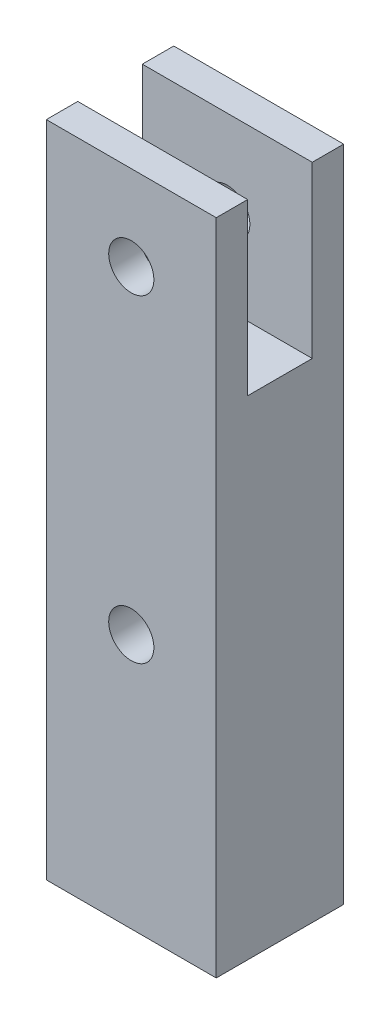
ISO-10303-21;
HEADER;
FILE_DESCRIPTION(('STEP AP214'),'2;1');
FILE_NAME('part.step','',(''),(''),'','','');
FILE_SCHEMA(('AUTOMOTIVE_DESIGN { 1 0 10303 214 1 1 1 1 }'));
ENDSEC;
DATA;
#1=APPLICATION_CONTEXT('core data for automotive mechanical design processes');
#2=APPLICATION_PROTOCOL_DEFINITION('international standard','automotive_design',2000,#1);
#3=PRODUCT_CONTEXT('',#1,'mechanical');
#4=PRODUCT('Part','Part','',(#3));
#5=PRODUCT_RELATED_PRODUCT_CATEGORY('part','',(#4));
#6=PRODUCT_DEFINITION_FORMATION('','',#4);
#7=PRODUCT_DEFINITION_CONTEXT('part definition',#1,'design');
#8=PRODUCT_DEFINITION('design','',#6,#7);
#9=PRODUCT_DEFINITION_SHAPE('','',#8);
#10=(LENGTH_UNIT() NAMED_UNIT(*) SI_UNIT(.MILLI.,.METRE.));
#11=(NAMED_UNIT(*) PLANE_ANGLE_UNIT() SI_UNIT($,.RADIAN.));
#12=(NAMED_UNIT(*) SI_UNIT($,.STERADIAN.) SOLID_ANGLE_UNIT());
#13=UNCERTAINTY_MEASURE_WITH_UNIT(LENGTH_MEASURE(1.E-05),#10,'distance_accuracy_value','');
#14=(GEOMETRIC_REPRESENTATION_CONTEXT(3) GLOBAL_UNCERTAINTY_ASSIGNED_CONTEXT((#13)) GLOBAL_UNIT_ASSIGNED_CONTEXT((#10,
#11,#12)) REPRESENTATION_CONTEXT('',''));
#15=CARTESIAN_POINT('',(0.,0.,0.));
#16=DIRECTION('',(0.,0.,1.));
#17=DIRECTION('',(1.,0.,0.));
#18=AXIS2_PLACEMENT_3D('',#15,#16,#17);
#19=CARTESIAN_POINT('',(-12.7,36.5125,9.525));
#20=DIRECTION('',(0.,-1.,0.));
#21=DIRECTION('',(1.,0.,0.));
#22=AXIS2_PLACEMENT_3D('',#19,#20,#21);
#23=PLANE('',#22);
#24=DIRECTION('',(0.,0.,-1.));
#25=VECTOR('',#24,1.);
#26=CARTESIAN_POINT('',(12.7,36.5125,9.525));
#27=LINE('',#26,#25);
#28=CARTESIAN_POINT('',(12.7,36.5125,9.525));
#29=VERTEX_POINT('',#28);
#30=CARTESIAN_POINT('',(12.7,36.5125,4.826));
#31=VERTEX_POINT('',#30);
#32=EDGE_CURVE('E11',#29,#31,#27,.T.);
#33=ORIENTED_EDGE('',*,*,#32,.T.);
#34=DIRECTION('',(1.,0.,0.));
#35=VECTOR('',#34,1.);
#36=CARTESIAN_POINT('',(-12.7,36.5125,4.826));
#37=LINE('',#36,#35);
#38=CARTESIAN_POINT('',(-12.7,36.5125,4.826));
#39=VERTEX_POINT('',#38);
#40=EDGE_CURVE('E146',#39,#31,#37,.T.);
#41=ORIENTED_EDGE('',*,*,#40,.F.);
#42=DIRECTION('',(0.,0.,-1.));
#43=VECTOR('',#42,1.);
#44=CARTESIAN_POINT('',(-12.7,36.5125,9.525));
#45=LINE('',#44,#43);
#46=CARTESIAN_POINT('',(-12.7,36.5125,9.525));
#47=VERTEX_POINT('',#46);
#48=EDGE_CURVE('E137',#47,#39,#45,.T.);
#49=ORIENTED_EDGE('',*,*,#48,.F.);
#50=DIRECTION('',(-1.,0.,0.));
#51=VECTOR('',#50,1.);
#52=CARTESIAN_POINT('',(-12.7,36.5125,9.525));
#53=LINE('',#52,#51);
#54=EDGE_CURVE('E96',#29,#47,#53,.T.);
#55=ORIENTED_EDGE('',*,*,#54,.F.);
#56=EDGE_LOOP('',(#33,#41,#49,#55));
#57=FACE_BOUND('',#56,.T.);
#58=ADVANCED_FACE('F41',(#57),#23,.F.);
#59=CARTESIAN_POINT('',(0.,23.8125,9.525));
#60=DIRECTION('',(0.,0.,-1.));
#61=DIRECTION('',(-1.,0.,0.));
#62=AXIS2_PLACEMENT_3D('',#59,#60,#61);
#63=CYLINDRICAL_SURFACE('',#62,3.3782);
#64=CARTESIAN_POINT('',(0.,23.8125,4.826));
#65=DIRECTION('',(0.,0.,1.));
#66=DIRECTION('',(1.,0.,0.));
#67=AXIS2_PLACEMENT_3D('',#64,#65,#66);
#68=CIRCLE('',#67,3.3782);
#69=CARTESIAN_POINT('',(-3.3782,23.8125,4.826));
#70=VERTEX_POINT('',#69);
#71=EDGE_CURVE('E45',#70,#70,#68,.T.);
#72=CARTESIAN_POINT('',(0.,23.8125,9.525));
#73=DIRECTION('',(0.,0.,1.));
#74=DIRECTION('',(1.,0.,0.));
#75=AXIS2_PLACEMENT_3D('',#72,#73,#74);
#76=CIRCLE('',#75,3.3782);
#77=CARTESIAN_POINT('',(-3.3782,23.8125,9.525));
#78=VERTEX_POINT('',#77);
#79=EDGE_CURVE('E160',#78,#78,#76,.T.);
#80=CARTESIAN_POINT('',(-3.3782,23.8125,4.826));
#81=CARTESIAN_POINT('',(-3.3782,23.8125,4.87494791666667));
#82=CARTESIAN_POINT('',(-3.3782,23.8125,4.92389583333333));
#83=CARTESIAN_POINT('',(-3.3782,23.8125,5.02179166666667));
#84=CARTESIAN_POINT('',(-3.3782,23.8125,5.07073958333333));
#85=CARTESIAN_POINT('',(-3.3782,23.8125,5.16863541666667));
#86=CARTESIAN_POINT('',(-3.3782,23.8125,5.21758333333333));
#87=CARTESIAN_POINT('',(-3.3782,23.8125,5.31547916666667));
#88=CARTESIAN_POINT('',(-3.3782,23.8125,5.36442708333333));
#89=CARTESIAN_POINT('',(-3.3782,23.8125,5.46232291666667));
#90=CARTESIAN_POINT('',(-3.3782,23.8125,5.51127083333333));
#91=CARTESIAN_POINT('',(-3.3782,23.8125,5.60916666666667));
#92=CARTESIAN_POINT('',(-3.3782,23.8125,5.65811458333333));
#93=CARTESIAN_POINT('',(-3.3782,23.8125,5.75601041666667));
#94=CARTESIAN_POINT('',(-3.3782,23.8125,5.80495833333333));
#95=CARTESIAN_POINT('',(-3.3782,23.8125,5.90285416666667));
#96=CARTESIAN_POINT('',(-3.3782,23.8125,5.95180208333333));
#97=CARTESIAN_POINT('',(-3.3782,23.8125,6.04969791666667));
#98=CARTESIAN_POINT('',(-3.3782,23.8125,6.09864583333333));
#99=CARTESIAN_POINT('',(-3.3782,23.8125,6.19654166666667));
#100=CARTESIAN_POINT('',(-3.3782,23.8125,6.24548958333333));
#101=CARTESIAN_POINT('',(-3.3782,23.8125,6.34338541666667));
#102=CARTESIAN_POINT('',(-3.3782,23.8125,6.39233333333333));
#103=CARTESIAN_POINT('',(-3.3782,23.8125,6.49022916666667));
#104=CARTESIAN_POINT('',(-3.3782,23.8125,6.53917708333333));
#105=CARTESIAN_POINT('',(-3.3782,23.8125,6.63707291666667));
#106=CARTESIAN_POINT('',(-3.3782,23.8125,6.68602083333333));
#107=CARTESIAN_POINT('',(-3.3782,23.8125,6.78391666666667));
#108=CARTESIAN_POINT('',(-3.3782,23.8125,6.83286458333333));
#109=CARTESIAN_POINT('',(-3.3782,23.8125,6.93076041666667));
#110=CARTESIAN_POINT('',(-3.3782,23.8125,6.97970833333333));
#111=CARTESIAN_POINT('',(-3.3782,23.8125,7.07760416666667));
#112=CARTESIAN_POINT('',(-3.3782,23.8125,7.12655208333333));
#113=CARTESIAN_POINT('',(-3.3782,23.8125,7.22444791666667));
#114=CARTESIAN_POINT('',(-3.3782,23.8125,7.27339583333333));
#115=CARTESIAN_POINT('',(-3.3782,23.8125,7.37129166666667));
#116=CARTESIAN_POINT('',(-3.3782,23.8125,7.42023958333333));
#117=CARTESIAN_POINT('',(-3.3782,23.8125,7.51813541666667));
#118=CARTESIAN_POINT('',(-3.3782,23.8125,7.56708333333333));
#119=CARTESIAN_POINT('',(-3.3782,23.8125,7.66497916666667));
#120=CARTESIAN_POINT('',(-3.3782,23.8125,7.71392708333333));
#121=CARTESIAN_POINT('',(-3.3782,23.8125,7.81182291666667));
#122=CARTESIAN_POINT('',(-3.3782,23.8125,7.86077083333333));
#123=CARTESIAN_POINT('',(-3.3782,23.8125,7.95866666666667));
#124=CARTESIAN_POINT('',(-3.3782,23.8125,8.00761458333333));
#125=CARTESIAN_POINT('',(-3.3782,23.8125,8.10551041666667));
#126=CARTESIAN_POINT('',(-3.3782,23.8125,8.15445833333333));
#127=CARTESIAN_POINT('',(-3.3782,23.8125,8.25235416666667));
#128=CARTESIAN_POINT('',(-3.3782,23.8125,8.30130208333333));
#129=CARTESIAN_POINT('',(-3.3782,23.8125,8.39919791666667));
#130=CARTESIAN_POINT('',(-3.3782,23.8125,8.44814583333333));
#131=CARTESIAN_POINT('',(-3.3782,23.8125,8.54604166666667));
#132=CARTESIAN_POINT('',(-3.3782,23.8125,8.59498958333333));
#133=CARTESIAN_POINT('',(-3.3782,23.8125,8.69288541666667));
#134=CARTESIAN_POINT('',(-3.3782,23.8125,8.74183333333333));
#135=CARTESIAN_POINT('',(-3.3782,23.8125,8.83972916666667));
#136=CARTESIAN_POINT('',(-3.3782,23.8125,8.88867708333333));
#137=CARTESIAN_POINT('',(-3.3782,23.8125,8.98657291666667));
#138=CARTESIAN_POINT('',(-3.3782,23.8125,9.03552083333333));
#139=CARTESIAN_POINT('',(-3.3782,23.8125,9.13341666666667));
#140=CARTESIAN_POINT('',(-3.3782,23.8125,9.18236458333333));
#141=CARTESIAN_POINT('',(-3.3782,23.8125,9.28026041666667));
#142=CARTESIAN_POINT('',(-3.3782,23.8125,9.32920833333333));
#143=CARTESIAN_POINT('',(-3.3782,23.8125,9.42710416666667));
#144=CARTESIAN_POINT('',(-3.3782,23.8125,9.47605208333333));
#145=CARTESIAN_POINT('',(-3.3782,23.8125,9.525));
#146=B_SPLINE_CURVE_WITH_KNOTS('',3,(#80,#81,#82,#83,#84,#85,#86,#87,#88,#89,#90,#91,#92,#93,
#94,#95,#96,#97,#98,#99,#100,#101,#102,#103,#104,#105,#106,#107,#108,#109,#110,#111,#112,#113,
#114,#115,#116,#117,#118,#119,#120,#121,#122,#123,#124,#125,#126,#127,#128,#129,#130,#131,#132,
#133,#134,#135,#136,#137,#138,#139,#140,#141,#142,#143,#144,#145),.UNSPECIFIED.,.F.,.F.,(4,2,2,
2,2,2,2,2,2,2,2,2,2,2,2,2,2,2,2,2,2,2,2,2,2,2,2,2,2,2,2,2,4),(0.,0.14684375,0.2936875,
0.44053125,0.587375,0.73421875,0.881062499999999,1.02790625,1.17475,1.32159375,1.4684375,
1.61528125,1.762125,1.90896875,2.0558125,2.20265625,2.3495,2.49634375,2.6431875,2.79003125,
2.936875,3.08371875,3.2305625,3.37740625,3.52425,3.67109375,3.8179375,3.96478125,4.111625,
4.25846875,4.4053125,4.55215625,4.699),.UNSPECIFIED.);
#147=EDGE_CURVE('BSEAM192',#70,#78,#146,.T.);
#148=ORIENTED_EDGE('',*,*,#71,.F.);
#149=ORIENTED_EDGE('',*,*,#79,.T.);
#150=ORIENTED_EDGE('',*,*,#147,.T.);
#151=ORIENTED_EDGE('',*,*,#147,.F.);
#152=EDGE_LOOP('',(#148,#150,#149,#151));
#153=FACE_BOUND('',#152,.T.);
#154=ADVANCED_FACE('F192',(#153),#63,.F.);
#155=CARTESIAN_POINT('',(0.,0.,9.525));
#156=DIRECTION('',(0.,0.,1.));
#157=DIRECTION('',(1.,0.,0.));
#158=AXIS2_PLACEMENT_3D('',#155,#156,#157);
#159=PLANE('',#158);
#160=ORIENTED_EDGE('',*,*,#79,.F.);
#161=EDGE_LOOP('',(#160));
#162=FACE_BOUND('',#161,.T.);
#163=DIRECTION('',(0.,1.,0.));
#164=VECTOR('',#163,1.);
#165=CARTESIAN_POINT('',(12.7,36.5125,9.525));
#166=LINE('',#165,#164);
#167=CARTESIAN_POINT('',(12.7,-61.9125,9.525));
#168=VERTEX_POINT('',#167);
#169=EDGE_CURVE('E67',#168,#29,#166,.T.);
#170=ORIENTED_EDGE('',*,*,#169,.T.);
#171=ORIENTED_EDGE('',*,*,#54,.T.);
#172=DIRECTION('',(0.,-1.,0.));
#173=VECTOR('',#172,1.);
#174=CARTESIAN_POINT('',(-12.7,23.8125,9.525));
#175=LINE('',#174,#173);
#176=CARTESIAN_POINT('',(-12.7,-61.9125,9.525));
#177=VERTEX_POINT('',#176);
#178=EDGE_CURVE('E169',#47,#177,#175,.T.);
#179=ORIENTED_EDGE('',*,*,#178,.T.);
#180=DIRECTION('',(1.,0.,0.));
#181=VECTOR('',#180,1.);
#182=CARTESIAN_POINT('',(-12.7,-61.9125,9.525));
#183=LINE('',#182,#181);
#184=EDGE_CURVE('E171',#177,#168,#183,.T.);
#185=ORIENTED_EDGE('',*,*,#184,.T.);
#186=EDGE_LOOP('',(#170,#171,#179,#185));
#187=FACE_BOUND('',#186,.T.);
#188=CARTESIAN_POINT('',(0.,-23.8125,9.525));
#189=DIRECTION('',(0.,0.,1.));
#190=DIRECTION('',(1.,0.,0.));
#191=AXIS2_PLACEMENT_3D('',#188,#189,#190);
#192=CIRCLE('',#191,3.3782);
#193=CARTESIAN_POINT('',(-3.3782,-23.8125,9.525));
#194=VERTEX_POINT('',#193);
#195=EDGE_CURVE('E153',#194,#194,#192,.T.);
#196=ORIENTED_EDGE('',*,*,#195,.F.);
#197=EDGE_LOOP('',(#196));
#198=FACE_BOUND('',#197,.T.);
#199=ADVANCED_FACE('F195',(#162,#187,#198),#159,.T.);
#200=CARTESIAN_POINT('',(0.,0.,-9.525));
#201=DIRECTION('',(0.,0.,1.));
#202=DIRECTION('',(1.,0.,0.));
#203=AXIS2_PLACEMENT_3D('',#200,#201,#202);
#204=PLANE('',#203);
#205=DIRECTION('',(-1.,0.,0.));
#206=VECTOR('',#205,1.);
#207=CARTESIAN_POINT('',(-12.7,36.5125,-9.525));
#208=LINE('',#207,#206);
#209=CARTESIAN_POINT('',(12.7,36.5125,-9.525));
#210=VERTEX_POINT('',#209);
#211=CARTESIAN_POINT('',(-12.7,36.5125,-9.525));
#212=VERTEX_POINT('',#211);
#213=EDGE_CURVE('E163',#210,#212,#208,.T.);
#214=ORIENTED_EDGE('',*,*,#213,.F.);
#215=DIRECTION('',(0.,1.,0.));
#216=VECTOR('',#215,1.);
#217=CARTESIAN_POINT('',(12.7,-61.9125,-9.525));
#218=LINE('',#217,#216);
#219=CARTESIAN_POINT('',(12.7,-61.9125,-9.525));
#220=VERTEX_POINT('',#219);
#221=EDGE_CURVE('E167',#220,#210,#218,.T.);
#222=ORIENTED_EDGE('',*,*,#221,.F.);
#223=DIRECTION('',(1.,0.,0.));
#224=VECTOR('',#223,1.);
#225=CARTESIAN_POINT('',(-12.7,-61.9125,-9.525));
#226=LINE('',#225,#224);
#227=CARTESIAN_POINT('',(-12.7,-61.9125,-9.525));
#228=VERTEX_POINT('',#227);
#229=EDGE_CURVE('E90',#228,#220,#226,.T.);
#230=ORIENTED_EDGE('',*,*,#229,.F.);
#231=DIRECTION('',(0.,-1.,0.));
#232=VECTOR('',#231,1.);
#233=CARTESIAN_POINT('',(-12.7,-61.9125,-9.525));
#234=LINE('',#233,#232);
#235=EDGE_CURVE('E176',#212,#228,#234,.T.);
#236=ORIENTED_EDGE('',*,*,#235,.F.);
#237=EDGE_LOOP('',(#214,#222,#230,#236));
#238=FACE_BOUND('',#237,.T.);
#239=CARTESIAN_POINT('',(0.,23.8125,-9.525));
#240=DIRECTION('',(0.,0.,1.));
#241=DIRECTION('',(1.,0.,0.));
#242=AXIS2_PLACEMENT_3D('',#239,#240,#241);
#243=CIRCLE('',#242,3.3782);
#244=CARTESIAN_POINT('',(-3.3782,23.8125,-9.525));
#245=VERTEX_POINT('',#244);
#246=EDGE_CURVE('E156',#245,#245,#243,.T.);
#247=ORIENTED_EDGE('',*,*,#246,.T.);
#248=EDGE_LOOP('',(#247));
#249=FACE_BOUND('',#248,.T.);
#250=CARTESIAN_POINT('',(0.,-23.8125,-9.525));
#251=DIRECTION('',(0.,0.,1.));
#252=DIRECTION('',(1.,0.,0.));
#253=AXIS2_PLACEMENT_3D('',#250,#251,#252);
#254=CIRCLE('',#253,3.3782);
#255=CARTESIAN_POINT('',(-3.3782,-23.8125,-9.525));
#256=VERTEX_POINT('',#255);
#257=EDGE_CURVE('E157',#256,#256,#254,.T.);
#258=ORIENTED_EDGE('',*,*,#257,.T.);
#259=EDGE_LOOP('',(#258));
#260=FACE_BOUND('',#259,.T.);
#261=ADVANCED_FACE('F202',(#238,#249,#260),#204,.F.);
#262=CARTESIAN_POINT('',(-12.7,36.5125,-4.826));
#263=VERTEX_POINT('',#262);
#264=EDGE_CURVE('E184',#263,#212,#45,.T.);
#265=ORIENTED_EDGE('',*,*,#264,.F.);
#266=DIRECTION('',(1.,0.,0.));
#267=VECTOR('',#266,1.);
#268=CARTESIAN_POINT('',(-12.7,36.5125,-4.826));
#269=LINE('',#268,#267);
#270=CARTESIAN_POINT('',(12.7,36.5125,-4.826));
#271=VERTEX_POINT('',#270);
#272=EDGE_CURVE('E149',#263,#271,#269,.T.);
#273=ORIENTED_EDGE('',*,*,#272,.T.);
#274=EDGE_CURVE('E50',#271,#210,#27,.T.);
#275=ORIENTED_EDGE('',*,*,#274,.T.);
#276=ORIENTED_EDGE('',*,*,#213,.T.);
#277=EDGE_LOOP('',(#265,#273,#275,#276));
#278=FACE_BOUND('',#277,.T.);
#279=ADVANCED_FACE('F43',(#278),#23,.F.);
#280=CARTESIAN_POINT('',(-12.7,-61.9125,9.525));
#281=DIRECTION('',(1.,0.,0.));
#282=DIRECTION('',(0.,0.,-1.));
#283=AXIS2_PLACEMENT_3D('',#280,#281,#282);
#284=PLANE('',#283);
#285=ORIENTED_EDGE('',*,*,#48,.T.);
#286=DIRECTION('',(0.,-1.,0.));
#287=VECTOR('',#286,1.);
#288=CARTESIAN_POINT('',(-12.7,11.1125,4.826));
#289=LINE('',#288,#287);
#290=CARTESIAN_POINT('',(-12.7,11.1125,4.826));
#291=VERTEX_POINT('',#290);
#292=EDGE_CURVE('E119',#39,#291,#289,.T.);
#293=ORIENTED_EDGE('',*,*,#292,.T.);
#294=DIRECTION('',(0.,0.,-1.));
#295=VECTOR('',#294,1.);
#296=CARTESIAN_POINT('',(-12.7,11.1125,-4.826));
#297=LINE('',#296,#295);
#298=CARTESIAN_POINT('',(-12.7,11.1125,-4.826));
#299=VERTEX_POINT('',#298);
#300=EDGE_CURVE('E128',#291,#299,#297,.T.);
#301=ORIENTED_EDGE('',*,*,#300,.T.);
#302=DIRECTION('',(0.,1.,0.));
#303=VECTOR('',#302,1.);
#304=CARTESIAN_POINT('',(-12.7,11.1125,-4.826));
#305=LINE('',#304,#303);
#306=EDGE_CURVE('E125',#299,#263,#305,.T.);
#307=ORIENTED_EDGE('',*,*,#306,.T.);
#308=ORIENTED_EDGE('',*,*,#264,.T.);
#309=ORIENTED_EDGE('',*,*,#235,.T.);
#310=DIRECTION('',(0.,0.,-1.));
#311=VECTOR('',#310,1.);
#312=CARTESIAN_POINT('',(-12.7,-61.9125,9.525));
#313=LINE('',#312,#311);
#314=EDGE_CURVE('E182',#177,#228,#313,.T.);
#315=ORIENTED_EDGE('',*,*,#314,.F.);
#316=ORIENTED_EDGE('',*,*,#178,.F.);
#317=EDGE_LOOP('',(#285,#293,#301,#307,#308,#309,#315,#316));
#318=FACE_BOUND('',#317,.T.);
#319=ADVANCED_FACE('F135',(#318),#284,.F.);
#320=CARTESIAN_POINT('',(-12.7,-61.9125,9.525));
#321=DIRECTION('',(0.,1.,0.));
#322=DIRECTION('',(0.,0.,1.));
#323=AXIS2_PLACEMENT_3D('',#320,#321,#322);
#324=PLANE('',#323);
#325=ORIENTED_EDGE('',*,*,#229,.T.);
#326=DIRECTION('',(0.,0.,-1.));
#327=VECTOR('',#326,1.);
#328=CARTESIAN_POINT('',(12.7,-61.9125,9.525));
#329=LINE('',#328,#327);
#330=EDGE_CURVE('E173',#168,#220,#329,.T.);
#331=ORIENTED_EDGE('',*,*,#330,.F.);
#332=ORIENTED_EDGE('',*,*,#184,.F.);
#333=ORIENTED_EDGE('',*,*,#314,.T.);
#334=EDGE_LOOP('',(#325,#331,#332,#333));
#335=FACE_BOUND('',#334,.T.);
#336=ADVANCED_FACE('F237',(#335),#324,.F.);
#337=CARTESIAN_POINT('',(12.7,-61.9125,9.525));
#338=DIRECTION('',(-1.,0.,0.));
#339=DIRECTION('',(0.,0.,1.));
#340=AXIS2_PLACEMENT_3D('',#337,#338,#339);
#341=PLANE('',#340);
#342=DIRECTION('',(0.,0.,-1.));
#343=VECTOR('',#342,1.);
#344=CARTESIAN_POINT('',(12.7,11.1125,-4.826));
#345=LINE('',#344,#343);
#346=CARTESIAN_POINT('',(12.7,11.1125,4.826));
#347=VERTEX_POINT('',#346);
#348=CARTESIAN_POINT('',(12.7,11.1125,-4.826));
#349=VERTEX_POINT('',#348);
#350=EDGE_CURVE('E140',#347,#349,#345,.T.);
#351=ORIENTED_EDGE('',*,*,#350,.F.);
#352=DIRECTION('',(0.,-1.,0.));
#353=VECTOR('',#352,1.);
#354=CARTESIAN_POINT('',(12.7,11.1125,4.826));
#355=LINE('',#354,#353);
#356=EDGE_CURVE('E58',#31,#347,#355,.T.);
#357=ORIENTED_EDGE('',*,*,#356,.F.);
#358=ORIENTED_EDGE('',*,*,#32,.F.);
#359=ORIENTED_EDGE('',*,*,#169,.F.);
#360=ORIENTED_EDGE('',*,*,#330,.T.);
#361=ORIENTED_EDGE('',*,*,#221,.T.);
#362=ORIENTED_EDGE('',*,*,#274,.F.);
#363=DIRECTION('',(0.,1.,0.));
#364=VECTOR('',#363,1.);
#365=CARTESIAN_POINT('',(12.7,11.1125,-4.826));
#366=LINE('',#365,#364);
#367=EDGE_CURVE('E138',#349,#271,#366,.T.);
#368=ORIENTED_EDGE('',*,*,#367,.F.);
#369=EDGE_LOOP('',(#351,#357,#358,#359,#360,#361,#362,#368));
#370=FACE_BOUND('',#369,.T.);
#371=ADVANCED_FACE('F227',(#370),#341,.F.);
#372=CARTESIAN_POINT('',(0.,23.8125,-4.826));
#373=DIRECTION('',(0.,0.,-1.));
#374=DIRECTION('',(-1.,0.,0.));
#375=AXIS2_PLACEMENT_3D('',#372,#373,#374);
#376=CIRCLE('',#375,3.3782);
#377=CARTESIAN_POINT('',(-3.3782,23.8125,-4.826));
#378=VERTEX_POINT('',#377);
#379=EDGE_CURVE('E148',#378,#378,#376,.T.);
#380=CARTESIAN_POINT('',(-3.3782,23.8125,-4.826));
#381=CARTESIAN_POINT('',(-3.3782,23.8125,-4.87494791666666));
#382=CARTESIAN_POINT('',(-3.3782,23.8125,-4.92389583333333));
#383=CARTESIAN_POINT('',(-3.3782,23.8125,-5.02179166666666));
#384=CARTESIAN_POINT('',(-3.3782,23.8125,-5.07073958333333));
#385=CARTESIAN_POINT('',(-3.3782,23.8125,-5.16863541666666));
#386=CARTESIAN_POINT('',(-3.3782,23.8125,-5.21758333333333));
#387=CARTESIAN_POINT('',(-3.3782,23.8125,-5.31547916666666));
#388=CARTESIAN_POINT('',(-3.3782,23.8125,-5.36442708333333));
#389=CARTESIAN_POINT('',(-3.3782,23.8125,-5.46232291666666));
#390=CARTESIAN_POINT('',(-3.3782,23.8125,-5.51127083333333));
#391=CARTESIAN_POINT('',(-3.3782,23.8125,-5.60916666666667));
#392=CARTESIAN_POINT('',(-3.3782,23.8125,-5.65811458333333));
#393=CARTESIAN_POINT('',(-3.3782,23.8125,-5.75601041666667));
#394=CARTESIAN_POINT('',(-3.3782,23.8125,-5.80495833333333));
#395=CARTESIAN_POINT('',(-3.3782,23.8125,-5.90285416666667));
#396=CARTESIAN_POINT('',(-3.3782,23.8125,-5.95180208333333));
#397=CARTESIAN_POINT('',(-3.3782,23.8125,-6.04969791666667));
#398=CARTESIAN_POINT('',(-3.3782,23.8125,-6.09864583333333));
#399=CARTESIAN_POINT('',(-3.3782,23.8125,-6.19654166666666));
#400=CARTESIAN_POINT('',(-3.3782,23.8125,-6.24548958333333));
#401=CARTESIAN_POINT('',(-3.3782,23.8125,-6.34338541666666));
#402=CARTESIAN_POINT('',(-3.3782,23.8125,-6.39233333333333));
#403=CARTESIAN_POINT('',(-3.3782,23.8125,-6.49022916666666));
#404=CARTESIAN_POINT('',(-3.3782,23.8125,-6.53917708333333));
#405=CARTESIAN_POINT('',(-3.3782,23.8125,-6.63707291666667));
#406=CARTESIAN_POINT('',(-3.3782,23.8125,-6.68602083333333));
#407=CARTESIAN_POINT('',(-3.3782,23.8125,-6.78391666666666));
#408=CARTESIAN_POINT('',(-3.3782,23.8125,-6.83286458333333));
#409=CARTESIAN_POINT('',(-3.3782,23.8125,-6.93076041666666));
#410=CARTESIAN_POINT('',(-3.3782,23.8125,-6.97970833333333));
#411=CARTESIAN_POINT('',(-3.3782,23.8125,-7.07760416666666));
#412=CARTESIAN_POINT('',(-3.3782,23.8125,-7.12655208333333));
#413=CARTESIAN_POINT('',(-3.3782,23.8125,-7.22444791666666));
#414=CARTESIAN_POINT('',(-3.3782,23.8125,-7.27339583333333));
#415=CARTESIAN_POINT('',(-3.3782,23.8125,-7.37129166666666));
#416=CARTESIAN_POINT('',(-3.3782,23.8125,-7.42023958333333));
#417=CARTESIAN_POINT('',(-3.3782,23.8125,-7.51813541666666));
#418=CARTESIAN_POINT('',(-3.3782,23.8125,-7.56708333333333));
#419=CARTESIAN_POINT('',(-3.3782,23.8125,-7.66497916666666));
#420=CARTESIAN_POINT('',(-3.3782,23.8125,-7.71392708333333));
#421=CARTESIAN_POINT('',(-3.3782,23.8125,-7.81182291666666));
#422=CARTESIAN_POINT('',(-3.3782,23.8125,-7.86077083333333));
#423=CARTESIAN_POINT('',(-3.3782,23.8125,-7.95866666666666));
#424=CARTESIAN_POINT('',(-3.3782,23.8125,-8.00761458333333));
#425=CARTESIAN_POINT('',(-3.3782,23.8125,-8.10551041666666));
#426=CARTESIAN_POINT('',(-3.3782,23.8125,-8.15445833333333));
#427=CARTESIAN_POINT('',(-3.3782,23.8125,-8.25235416666666));
#428=CARTESIAN_POINT('',(-3.3782,23.8125,-8.30130208333333));
#429=CARTESIAN_POINT('',(-3.3782,23.8125,-8.39919791666667));
#430=CARTESIAN_POINT('',(-3.3782,23.8125,-8.44814583333333));
#431=CARTESIAN_POINT('',(-3.3782,23.8125,-8.54604166666667));
#432=CARTESIAN_POINT('',(-3.3782,23.8125,-8.59498958333333));
#433=CARTESIAN_POINT('',(-3.3782,23.8125,-8.69288541666667));
#434=CARTESIAN_POINT('',(-3.3782,23.8125,-8.74183333333333));
#435=CARTESIAN_POINT('',(-3.3782,23.8125,-8.83972916666667));
#436=CARTESIAN_POINT('',(-3.3782,23.8125,-8.88867708333333));
#437=CARTESIAN_POINT('',(-3.3782,23.8125,-8.98657291666667));
#438=CARTESIAN_POINT('',(-3.3782,23.8125,-9.03552083333333));
#439=CARTESIAN_POINT('',(-3.3782,23.8125,-9.13341666666667));
#440=CARTESIAN_POINT('',(-3.3782,23.8125,-9.18236458333333));
#441=CARTESIAN_POINT('',(-3.3782,23.8125,-9.28026041666667));
#442=CARTESIAN_POINT('',(-3.3782,23.8125,-9.32920833333333));
#443=CARTESIAN_POINT('',(-3.3782,23.8125,-9.42710416666667));
#444=CARTESIAN_POINT('',(-3.3782,23.8125,-9.47605208333333));
#445=CARTESIAN_POINT('',(-3.3782,23.8125,-9.525));
#446=B_SPLINE_CURVE_WITH_KNOTS('',3,(#380,#381,#382,#383,#384,#385,#386,#387,#388,#389,#390,
#391,#392,#393,#394,#395,#396,#397,#398,#399,#400,#401,#402,#403,#404,#405,#406,#407,#408,#409,
#410,#411,#412,#413,#414,#415,#416,#417,#418,#419,#420,#421,#422,#423,#424,#425,#426,#427,#428,
#429,#430,#431,#432,#433,#434,#435,#436,#437,#438,#439,#440,#441,#442,#443,#444,#445),
.UNSPECIFIED.,.F.,.F.,(4,2,2,2,2,2,2,2,2,2,2,2,2,2,2,2,2,2,2,2,2,2,2,2,2,2,2,2,2,2,2,2,4),(0.,
0.14684375,0.293687500000001,0.440531250000001,0.587375000000001,0.734218750000001,
0.881062500000002,1.02790625,1.17475,1.32159375,1.4684375,1.61528125,1.762125,1.90896875,
2.0558125,2.20265625,2.3495,2.49634375,2.6431875,2.79003125,2.936875,3.08371875,3.2305625,
3.37740625,3.52425,3.67109375,3.8179375,3.96478125,4.111625,4.25846875,4.4053125,4.55215625,
4.699),.UNSPECIFIED.);
#447=EDGE_CURVE('BSEAM197',#378,#245,#446,.T.);
#448=ORIENTED_EDGE('',*,*,#379,.F.);
#449=ORIENTED_EDGE('',*,*,#246,.F.);
#450=ORIENTED_EDGE('',*,*,#447,.T.);
#451=ORIENTED_EDGE('',*,*,#447,.F.);
#452=EDGE_LOOP('',(#448,#450,#449,#451));
#453=FACE_BOUND('',#452,.T.);
#454=ADVANCED_FACE('F197',(#453),#63,.F.);
#455=CARTESIAN_POINT('',(0.,-23.8125,9.525));
#456=DIRECTION('',(0.,0.,-1.));
#457=DIRECTION('',(-1.,0.,0.));
#458=AXIS2_PLACEMENT_3D('',#455,#456,#457);
#459=CYLINDRICAL_SURFACE('',#458,3.3782);
#460=CARTESIAN_POINT('',(-3.3782,-23.8125,9.525));
#461=CARTESIAN_POINT('',(-3.3782,-23.8125,9.3265625));
#462=CARTESIAN_POINT('',(-3.3782,-23.8125,9.128125));
#463=CARTESIAN_POINT('',(-3.3782,-23.8125,8.73125));
#464=CARTESIAN_POINT('',(-3.3782,-23.8125,8.5328125));
#465=CARTESIAN_POINT('',(-3.3782,-23.8125,8.1359375));
#466=CARTESIAN_POINT('',(-3.3782,-23.8125,7.9375));
#467=CARTESIAN_POINT('',(-3.3782,-23.8125,7.540625));
#468=CARTESIAN_POINT('',(-3.3782,-23.8125,7.3421875));
#469=CARTESIAN_POINT('',(-3.3782,-23.8125,6.9453125));
#470=CARTESIAN_POINT('',(-3.3782,-23.8125,6.746875));
#471=CARTESIAN_POINT('',(-3.3782,-23.8125,6.35));
#472=CARTESIAN_POINT('',(-3.3782,-23.8125,6.1515625));
#473=CARTESIAN_POINT('',(-3.3782,-23.8125,5.7546875));
#474=CARTESIAN_POINT('',(-3.3782,-23.8125,5.55625));
#475=CARTESIAN_POINT('',(-3.3782,-23.8125,5.159375));
#476=CARTESIAN_POINT('',(-3.3782,-23.8125,4.9609375));
#477=CARTESIAN_POINT('',(-3.3782,-23.8125,4.5640625));
#478=CARTESIAN_POINT('',(-3.3782,-23.8125,4.365625));
#479=CARTESIAN_POINT('',(-3.3782,-23.8125,3.96875));
#480=CARTESIAN_POINT('',(-3.3782,-23.8125,3.7703125));
#481=CARTESIAN_POINT('',(-3.3782,-23.8125,3.3734375));
#482=CARTESIAN_POINT('',(-3.3782,-23.8125,3.175));
#483=CARTESIAN_POINT('',(-3.3782,-23.8125,2.778125));
#484=CARTESIAN_POINT('',(-3.3782,-23.8125,2.5796875));
#485=CARTESIAN_POINT('',(-3.3782,-23.8125,2.1828125));
#486=CARTESIAN_POINT('',(-3.3782,-23.8125,1.984375));
#487=CARTESIAN_POINT('',(-3.3782,-23.8125,1.5875));
#488=CARTESIAN_POINT('',(-3.3782,-23.8125,1.3890625));
#489=CARTESIAN_POINT('',(-3.3782,-23.8125,0.992187500000001));
#490=CARTESIAN_POINT('',(-3.3782,-23.8125,0.793750000000001));
#491=CARTESIAN_POINT('',(-3.3782,-23.8125,0.396875));
#492=CARTESIAN_POINT('',(-3.3782,-23.8125,0.1984375));
#493=CARTESIAN_POINT('',(-3.3782,-23.8125,-0.1984375));
#494=CARTESIAN_POINT('',(-3.3782,-23.8125,-0.396875));
#495=CARTESIAN_POINT('',(-3.3782,-23.8125,-0.793750000000001));
#496=CARTESIAN_POINT('',(-3.3782,-23.8125,-0.992187500000001));
#497=CARTESIAN_POINT('',(-3.3782,-23.8125,-1.3890625));
#498=CARTESIAN_POINT('',(-3.3782,-23.8125,-1.5875));
#499=CARTESIAN_POINT('',(-3.3782,-23.8125,-1.984375));
#500=CARTESIAN_POINT('',(-3.3782,-23.8125,-2.1828125));
#501=CARTESIAN_POINT('',(-3.3782,-23.8125,-2.5796875));
#502=CARTESIAN_POINT('',(-3.3782,-23.8125,-2.778125));
#503=CARTESIAN_POINT('',(-3.3782,-23.8125,-3.175));
#504=CARTESIAN_POINT('',(-3.3782,-23.8125,-3.3734375));
#505=CARTESIAN_POINT('',(-3.3782,-23.8125,-3.7703125));
#506=CARTESIAN_POINT('',(-3.3782,-23.8125,-3.96875));
#507=CARTESIAN_POINT('',(-3.3782,-23.8125,-4.365625));
#508=CARTESIAN_POINT('',(-3.3782,-23.8125,-4.5640625));
#509=CARTESIAN_POINT('',(-3.3782,-23.8125,-4.9609375));
#510=CARTESIAN_POINT('',(-3.3782,-23.8125,-5.159375));
#511=CARTESIAN_POINT('',(-3.3782,-23.8125,-5.55625));
#512=CARTESIAN_POINT('',(-3.3782,-23.8125,-5.7546875));
#513=CARTESIAN_POINT('',(-3.3782,-23.8125,-6.1515625));
#514=CARTESIAN_POINT('',(-3.3782,-23.8125,-6.35));
#515=CARTESIAN_POINT('',(-3.3782,-23.8125,-6.746875));
#516=CARTESIAN_POINT('',(-3.3782,-23.8125,-6.9453125));
#517=CARTESIAN_POINT('',(-3.3782,-23.8125,-7.3421875));
#518=CARTESIAN_POINT('',(-3.3782,-23.8125,-7.540625));
#519=CARTESIAN_POINT('',(-3.3782,-23.8125,-7.9375));
#520=CARTESIAN_POINT('',(-3.3782,-23.8125,-8.1359375));
#521=CARTESIAN_POINT('',(-3.3782,-23.8125,-8.5328125));
#522=CARTESIAN_POINT('',(-3.3782,-23.8125,-8.73125));
#523=CARTESIAN_POINT('',(-3.3782,-23.8125,-9.128125));
#524=CARTESIAN_POINT('',(-3.3782,-23.8125,-9.3265625));
#525=CARTESIAN_POINT('',(-3.3782,-23.8125,-9.525));
#526=B_SPLINE_CURVE_WITH_KNOTS('',3,(#460,#461,#462,#463,#464,#465,#466,#467,#468,#469,#470,
#471,#472,#473,#474,#475,#476,#477,#478,#479,#480,#481,#482,#483,#484,#485,#486,#487,#488,#489,
#490,#491,#492,#493,#494,#495,#496,#497,#498,#499,#500,#501,#502,#503,#504,#505,#506,#507,#508,
#509,#510,#511,#512,#513,#514,#515,#516,#517,#518,#519,#520,#521,#522,#523,#524,#525),
.UNSPECIFIED.,.F.,.F.,(4,2,2,2,2,2,2,2,2,2,2,2,2,2,2,2,2,2,2,2,2,2,2,2,2,2,2,2,2,2,2,2,4),(0.,
0.5953125,1.190625,1.7859375,2.38125,2.9765625,3.571875,4.1671875,4.7625,5.3578125,5.953125,
6.5484375,7.14375,7.7390625,8.334375,8.9296875,9.525,10.1203125,10.715625,11.3109375,11.90625,
12.5015625,13.096875,13.6921875,14.2875,14.8828125,15.478125,16.0734375,16.66875,17.2640625,
17.859375,18.4546875,19.05),.UNSPECIFIED.);
#527=EDGE_CURVE('BSEAM207',#194,#256,#526,.T.);
#528=ORIENTED_EDGE('',*,*,#195,.T.);
#529=ORIENTED_EDGE('',*,*,#257,.F.);
#530=ORIENTED_EDGE('',*,*,#527,.T.);
#531=ORIENTED_EDGE('',*,*,#527,.F.);
#532=EDGE_LOOP('',(#528,#530,#529,#531));
#533=FACE_BOUND('',#532,.T.);
#534=ADVANCED_FACE('F207',(#533),#459,.F.);
#535=CARTESIAN_POINT('',(-12.7,11.1125,4.826));
#536=DIRECTION('',(0.,0.,1.));
#537=DIRECTION('',(1.,0.,0.));
#538=AXIS2_PLACEMENT_3D('',#535,#536,#537);
#539=PLANE('',#538);
#540=ORIENTED_EDGE('',*,*,#71,.T.);
#541=EDGE_LOOP('',(#540));
#542=FACE_BOUND('',#541,.T.);
#543=ORIENTED_EDGE('',*,*,#356,.T.);
#544=DIRECTION('',(1.,0.,0.));
#545=VECTOR('',#544,1.);
#546=CARTESIAN_POINT('',(-12.7,11.1125,4.826));
#547=LINE('',#546,#545);
#548=EDGE_CURVE('E115',#291,#347,#547,.T.);
#549=ORIENTED_EDGE('',*,*,#548,.F.);
#550=ORIENTED_EDGE('',*,*,#292,.F.);
#551=ORIENTED_EDGE('',*,*,#40,.T.);
#552=EDGE_LOOP('',(#543,#549,#550,#551));
#553=FACE_BOUND('',#552,.T.);
#554=ADVANCED_FACE('F117',(#542,#553),#539,.F.);
#555=CARTESIAN_POINT('',(-12.7,11.1125,-4.826));
#556=DIRECTION('',(0.,0.,-1.));
#557=DIRECTION('',(-1.,0.,0.));
#558=AXIS2_PLACEMENT_3D('',#555,#556,#557);
#559=PLANE('',#558);
#560=ORIENTED_EDGE('',*,*,#379,.T.);
#561=EDGE_LOOP('',(#560));
#562=FACE_BOUND('',#561,.T.);
#563=ORIENTED_EDGE('',*,*,#367,.T.);
#564=ORIENTED_EDGE('',*,*,#272,.F.);
#565=ORIENTED_EDGE('',*,*,#306,.F.);
#566=DIRECTION('',(1.,0.,0.));
#567=VECTOR('',#566,1.);
#568=CARTESIAN_POINT('',(-12.7,11.1125,-4.826));
#569=LINE('',#568,#567);
#570=EDGE_CURVE('E124',#299,#349,#569,.T.);
#571=ORIENTED_EDGE('',*,*,#570,.T.);
#572=EDGE_LOOP('',(#563,#564,#565,#571));
#573=FACE_BOUND('',#572,.T.);
#574=ADVANCED_FACE('F231',(#562,#573),#559,.F.);
#575=CARTESIAN_POINT('',(-12.7,11.1125,-4.826));
#576=DIRECTION('',(0.,-1.,0.));
#577=DIRECTION('',(0.,0.,-1.));
#578=AXIS2_PLACEMENT_3D('',#575,#576,#577);
#579=PLANE('',#578);
#580=ORIENTED_EDGE('',*,*,#350,.T.);
#581=ORIENTED_EDGE('',*,*,#570,.F.);
#582=ORIENTED_EDGE('',*,*,#300,.F.);
#583=ORIENTED_EDGE('',*,*,#548,.T.);
#584=EDGE_LOOP('',(#580,#581,#582,#583));
#585=FACE_BOUND('',#584,.T.);
#586=ADVANCED_FACE('F129',(#585),#579,.F.);
#587=CLOSED_SHELL('',(#58,#154,#199,#261,#279,#319,#336,#371,#454,#534,#554,#574,#586));
#588=MANIFOLD_SOLID_BREP('B2',#587);
#589=ADVANCED_BREP_SHAPE_REPRESENTATION('',(#18,#588),#14);
#590=SHAPE_DEFINITION_REPRESENTATION(#9,#589);
ENDSEC;
END-ISO-10303-21;
